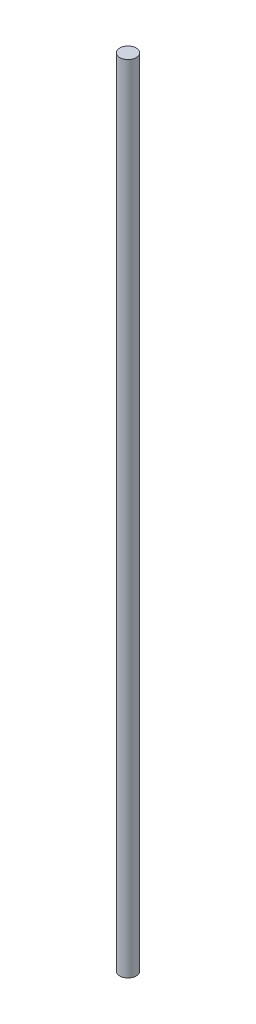
ISO-10303-21;
HEADER;
FILE_DESCRIPTION(('STEP AP214'),'2;1');
FILE_NAME('part.step','',(''),(''),'','','');
FILE_SCHEMA(('AUTOMOTIVE_DESIGN { 1 0 10303 214 1 1 1 1 }'));
ENDSEC;
DATA;
#1=APPLICATION_CONTEXT('core data for automotive mechanical design processes');
#2=APPLICATION_PROTOCOL_DEFINITION('international standard','automotive_design',2000,#1);
#3=PRODUCT_CONTEXT('',#1,'mechanical');
#4=PRODUCT('Part','Part','',(#3));
#5=PRODUCT_RELATED_PRODUCT_CATEGORY('part','',(#4));
#6=PRODUCT_DEFINITION_FORMATION('','',#4);
#7=PRODUCT_DEFINITION_CONTEXT('part definition',#1,'design');
#8=PRODUCT_DEFINITION('design','',#6,#7);
#9=PRODUCT_DEFINITION_SHAPE('','',#8);
#10=(LENGTH_UNIT() NAMED_UNIT(*) SI_UNIT(.MILLI.,.METRE.));
#11=(NAMED_UNIT(*) PLANE_ANGLE_UNIT() SI_UNIT($,.RADIAN.));
#12=(NAMED_UNIT(*) SI_UNIT($,.STERADIAN.) SOLID_ANGLE_UNIT());
#13=UNCERTAINTY_MEASURE_WITH_UNIT(LENGTH_MEASURE(1.E-05),#10,'distance_accuracy_value','');
#14=(GEOMETRIC_REPRESENTATION_CONTEXT(3) GLOBAL_UNCERTAINTY_ASSIGNED_CONTEXT((#13)) GLOBAL_UNIT_ASSIGNED_CONTEXT((#10,
#11,#12)) REPRESENTATION_CONTEXT('',''));
#15=CARTESIAN_POINT('',(0.,0.,0.));
#16=DIRECTION('',(0.,0.,1.));
#17=DIRECTION('',(1.,0.,0.));
#18=AXIS2_PLACEMENT_3D('',#15,#16,#17);
#19=CARTESIAN_POINT('',(0.,2438.4,0.));
#20=DIRECTION('',(0.,-1.,0.));
#21=DIRECTION('',(0.,0.,-1.));
#22=AXIS2_PLACEMENT_3D('',#19,#20,#21);
#23=CYLINDRICAL_SURFACE('',#22,25.4);
#24=CARTESIAN_POINT('',(0.,2438.4,0.));
#25=DIRECTION('',(0.,1.,0.));
#26=DIRECTION('',(0.,0.,1.));
#27=AXIS2_PLACEMENT_3D('',#24,#25,#26);
#28=CIRCLE('',#27,25.4);
#29=CARTESIAN_POINT('',(0.,2438.4,-25.4));
#30=VERTEX_POINT('',#29);
#31=EDGE_CURVE('E10',#30,#30,#28,.T.);
#32=CARTESIAN_POINT('',(0.,0.,0.));
#33=DIRECTION('',(0.,1.,0.));
#34=DIRECTION('',(0.,0.,1.));
#35=AXIS2_PLACEMENT_3D('',#32,#33,#34);
#36=CIRCLE('',#35,25.4);
#37=CARTESIAN_POINT('',(0.,0.,-25.4));
#38=VERTEX_POINT('',#37);
#39=EDGE_CURVE('E34',#38,#38,#36,.T.);
#40=CARTESIAN_POINT('',(0.,2438.4,-25.4));
#41=CARTESIAN_POINT('',(0.,2413.,-25.4));
#42=CARTESIAN_POINT('',(0.,2387.6,-25.4));
#43=CARTESIAN_POINT('',(0.,2336.8,-25.4));
#44=CARTESIAN_POINT('',(0.,2311.4,-25.4));
#45=CARTESIAN_POINT('',(0.,2260.6,-25.4));
#46=CARTESIAN_POINT('',(0.,2235.2,-25.4));
#47=CARTESIAN_POINT('',(0.,2184.4,-25.4));
#48=CARTESIAN_POINT('',(0.,2159.,-25.4));
#49=CARTESIAN_POINT('',(0.,2108.2,-25.4));
#50=CARTESIAN_POINT('',(0.,2082.8,-25.4));
#51=CARTESIAN_POINT('',(0.,2032.,-25.4));
#52=CARTESIAN_POINT('',(0.,2006.6,-25.4));
#53=CARTESIAN_POINT('',(0.,1955.8,-25.4));
#54=CARTESIAN_POINT('',(0.,1930.4,-25.4));
#55=CARTESIAN_POINT('',(0.,1879.6,-25.4));
#56=CARTESIAN_POINT('',(0.,1854.2,-25.4));
#57=CARTESIAN_POINT('',(0.,1803.4,-25.4));
#58=CARTESIAN_POINT('',(0.,1778.,-25.4));
#59=CARTESIAN_POINT('',(0.,1727.2,-25.4));
#60=CARTESIAN_POINT('',(0.,1701.8,-25.4));
#61=CARTESIAN_POINT('',(0.,1651.,-25.4));
#62=CARTESIAN_POINT('',(0.,1625.6,-25.4));
#63=CARTESIAN_POINT('',(0.,1574.8,-25.4));
#64=CARTESIAN_POINT('',(0.,1549.4,-25.4));
#65=CARTESIAN_POINT('',(0.,1498.6,-25.4));
#66=CARTESIAN_POINT('',(0.,1473.2,-25.4));
#67=CARTESIAN_POINT('',(0.,1422.4,-25.4));
#68=CARTESIAN_POINT('',(0.,1397.,-25.4));
#69=CARTESIAN_POINT('',(0.,1346.2,-25.4));
#70=CARTESIAN_POINT('',(0.,1320.8,-25.4));
#71=CARTESIAN_POINT('',(0.,1270.,-25.4));
#72=CARTESIAN_POINT('',(0.,1244.6,-25.4));
#73=CARTESIAN_POINT('',(0.,1193.8,-25.4));
#74=CARTESIAN_POINT('',(0.,1168.4,-25.4));
#75=CARTESIAN_POINT('',(0.,1117.6,-25.4));
#76=CARTESIAN_POINT('',(0.,1092.2,-25.4));
#77=CARTESIAN_POINT('',(0.,1041.4,-25.4));
#78=CARTESIAN_POINT('',(0.,1016.,-25.4));
#79=CARTESIAN_POINT('',(0.,965.2,-25.4));
#80=CARTESIAN_POINT('',(0.,939.8,-25.4));
#81=CARTESIAN_POINT('',(0.,889.,-25.4));
#82=CARTESIAN_POINT('',(0.,863.6,-25.4));
#83=CARTESIAN_POINT('',(0.,812.8,-25.4));
#84=CARTESIAN_POINT('',(0.,787.4,-25.4));
#85=CARTESIAN_POINT('',(0.,736.6,-25.4));
#86=CARTESIAN_POINT('',(0.,711.2,-25.4));
#87=CARTESIAN_POINT('',(0.,660.4,-25.4));
#88=CARTESIAN_POINT('',(0.,635.,-25.4));
#89=CARTESIAN_POINT('',(0.,584.2,-25.4));
#90=CARTESIAN_POINT('',(0.,558.8,-25.4));
#91=CARTESIAN_POINT('',(0.,508.,-25.4));
#92=CARTESIAN_POINT('',(0.,482.6,-25.4));
#93=CARTESIAN_POINT('',(0.,431.8,-25.4));
#94=CARTESIAN_POINT('',(0.,406.4,-25.4));
#95=CARTESIAN_POINT('',(0.,355.6,-25.4));
#96=CARTESIAN_POINT('',(0.,330.2,-25.4));
#97=CARTESIAN_POINT('',(0.,279.4,-25.4));
#98=CARTESIAN_POINT('',(0.,254.,-25.4));
#99=CARTESIAN_POINT('',(0.,203.2,-25.4));
#100=CARTESIAN_POINT('',(0.,177.8,-25.4));
#101=CARTESIAN_POINT('',(0.,127.,-25.4));
#102=CARTESIAN_POINT('',(0.,101.6,-25.4));
#103=CARTESIAN_POINT('',(0.,50.8,-25.4));
#104=CARTESIAN_POINT('',(0.,25.4,-25.4));
#105=CARTESIAN_POINT('',(0.,0.,-25.4));
#106=B_SPLINE_CURVE_WITH_KNOTS('',3,(#40,#41,#42,#43,#44,#45,#46,#47,#48,#49,#50,#51,#52,#53,
#54,#55,#56,#57,#58,#59,#60,#61,#62,#63,#64,#65,#66,#67,#68,#69,#70,#71,#72,#73,#74,#75,#76,#77,
#78,#79,#80,#81,#82,#83,#84,#85,#86,#87,#88,#89,#90,#91,#92,#93,#94,#95,#96,#97,#98,#99,#100,
#101,#102,#103,#104,#105),.UNSPECIFIED.,.F.,.F.,(4,2,2,2,2,2,2,2,2,2,2,2,2,2,2,2,2,2,2,2,2,2,2,
2,2,2,2,2,2,2,2,2,4),(0.,76.1999999999996,152.4,228.6,304.8,381.,457.2,533.4,609.6,685.8,762.,
838.2,914.4,990.6,1066.8,1143.,1219.2,1295.4,1371.6,1447.8,1524.,1600.2,1676.4,1752.6,1828.8,
1905.,1981.2,2057.4,2133.6,2209.8,2286.,2362.2,2438.4),.UNSPECIFIED.);
#107=EDGE_CURVE('BSEAM31',#30,#38,#106,.T.);
#108=ORIENTED_EDGE('',*,*,#31,.F.);
#109=ORIENTED_EDGE('',*,*,#39,.T.);
#110=ORIENTED_EDGE('',*,*,#107,.T.);
#111=ORIENTED_EDGE('',*,*,#107,.F.);
#112=EDGE_LOOP('',(#108,#110,#109,#111));
#113=FACE_BOUND('',#112,.T.);
#114=ADVANCED_FACE('F31',(#113),#23,.T.);
#115=CARTESIAN_POINT('',(0.,2438.4,0.));
#116=DIRECTION('',(0.,1.,0.));
#117=DIRECTION('',(0.,0.,1.));
#118=AXIS2_PLACEMENT_3D('',#115,#116,#117);
#119=PLANE('',#118);
#120=ORIENTED_EDGE('',*,*,#31,.T.);
#121=EDGE_LOOP('',(#120));
#122=FACE_BOUND('',#121,.T.);
#123=ADVANCED_FACE('F46',(#122),#119,.T.);
#124=CARTESIAN_POINT('',(0.,0.,0.));
#125=DIRECTION('',(0.,1.,0.));
#126=DIRECTION('',(0.,0.,1.));
#127=AXIS2_PLACEMENT_3D('',#124,#125,#126);
#128=PLANE('',#127);
#129=ORIENTED_EDGE('',*,*,#39,.F.);
#130=EDGE_LOOP('',(#129));
#131=FACE_BOUND('',#130,.T.);
#132=ADVANCED_FACE('F44',(#131),#128,.F.);
#133=CLOSED_SHELL('',(#114,#123,#132));
#134=MANIFOLD_SOLID_BREP('B2',#133);
#135=ADVANCED_BREP_SHAPE_REPRESENTATION('',(#18,#134),#14);
#136=SHAPE_DEFINITION_REPRESENTATION(#9,#135);
ENDSEC;
END-ISO-10303-21;
